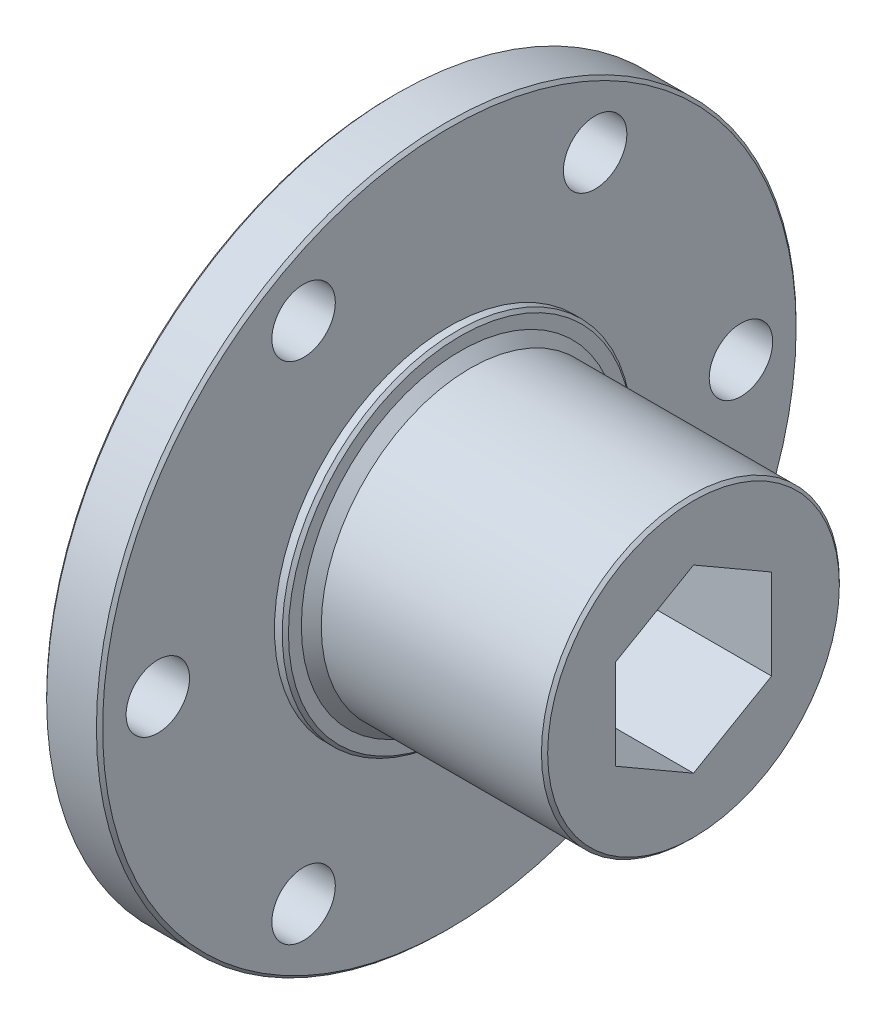
ISO-10303-21;
HEADER;
FILE_DESCRIPTION(('STEP AP214'),'2;1');
FILE_NAME('part.step','',(''),(''),'','','');
FILE_SCHEMA(('AUTOMOTIVE_DESIGN { 1 0 10303 214 1 1 1 1 }'));
ENDSEC;
DATA;
#1=APPLICATION_CONTEXT('core data for automotive mechanical design processes');
#2=APPLICATION_PROTOCOL_DEFINITION('international standard','automotive_design',2000,#1);
#3=PRODUCT_CONTEXT('',#1,'mechanical');
#4=PRODUCT('Part','Part','',(#3));
#5=PRODUCT_RELATED_PRODUCT_CATEGORY('part','',(#4));
#6=PRODUCT_DEFINITION_FORMATION('','',#4);
#7=PRODUCT_DEFINITION_CONTEXT('part definition',#1,'design');
#8=PRODUCT_DEFINITION('design','',#6,#7);
#9=PRODUCT_DEFINITION_SHAPE('','',#8);
#10=(LENGTH_UNIT() NAMED_UNIT(*) SI_UNIT(.MILLI.,.METRE.));
#11=(NAMED_UNIT(*) PLANE_ANGLE_UNIT() SI_UNIT($,.RADIAN.));
#12=(NAMED_UNIT(*) SI_UNIT($,.STERADIAN.) SOLID_ANGLE_UNIT());
#13=UNCERTAINTY_MEASURE_WITH_UNIT(LENGTH_MEASURE(1.E-05),#10,'distance_accuracy_value','');
#14=(GEOMETRIC_REPRESENTATION_CONTEXT(3) GLOBAL_UNCERTAINTY_ASSIGNED_CONTEXT((#13)) GLOBAL_UNIT_ASSIGNED_CONTEXT((#10,
#11,#12)) REPRESENTATION_CONTEXT('',''));
#15=CARTESIAN_POINT('',(0.,0.,0.));
#16=DIRECTION('',(0.,0.,1.));
#17=DIRECTION('',(1.,0.,0.));
#18=AXIS2_PLACEMENT_3D('',#15,#16,#17);
#19=CARTESIAN_POINT('',(-13.9240662460568,0.,0.));
#20=DIRECTION('',(-1.,0.,0.));
#21=DIRECTION('',(0.,0.,1.));
#22=AXIS2_PLACEMENT_3D('',#19,#20,#21);
#23=CYLINDRICAL_SURFACE('',#22,28.575);
#24=CARTESIAN_POINT('',(-18.2420662460566,0.,0.));
#25=DIRECTION('',(-1.,0.,0.));
#26=DIRECTION('',(0.,0.,1.));
#27=AXIS2_PLACEMENT_3D('',#24,#25,#26);
#28=CIRCLE('',#27,28.575);
#29=CARTESIAN_POINT('',(-18.2420662460566,0.,28.575));
#30=VERTEX_POINT('',#29);
#31=EDGE_CURVE('E174',#30,#30,#28,.F.);
#32=ORIENTED_EDGE('',*,*,#31,.T.);
#33=EDGE_LOOP('',(#32));
#34=FACE_BOUND('',#33,.T.);
#35=CARTESIAN_POINT('',(-14.1780662460569,0.,0.));
#36=DIRECTION('',(1.,0.,0.));
#37=DIRECTION('',(0.,0.,-1.));
#38=AXIS2_PLACEMENT_3D('',#35,#36,#37);
#39=CIRCLE('',#38,28.575);
#40=CARTESIAN_POINT('',(-14.1780662460569,0.,-28.575));
#41=VERTEX_POINT('',#40);
#42=EDGE_CURVE('E171',#41,#41,#39,.F.);
#43=ORIENTED_EDGE('',*,*,#42,.T.);
#44=EDGE_LOOP('',(#43));
#45=FACE_BOUND('',#44,.T.);
#46=ADVANCED_FACE('F37',(#34,#45),#23,.T.);
#47=CARTESIAN_POINT('',(-13.9240662460568,28.575,0.));
#48=DIRECTION('',(1.,0.,0.));
#49=DIRECTION('',(0.,0.,-1.));
#50=AXIS2_PLACEMENT_3D('',#47,#48,#49);
#51=PLANE('',#50);
#52=CARTESIAN_POINT('',(-13.9240662460568,0.,0.));
#53=DIRECTION('',(1.,0.,0.));
#54=DIRECTION('',(0.,0.,-1.));
#55=AXIS2_PLACEMENT_3D('',#52,#53,#54);
#56=CIRCLE('',#55,28.3209999999999);
#57=CARTESIAN_POINT('',(-13.9240662460568,0.,-28.3209999999999));
#58=VERTEX_POINT('',#57);
#59=EDGE_CURVE('E11',#58,#58,#56,.T.);
#60=ORIENTED_EDGE('',*,*,#59,.T.);
#61=EDGE_LOOP('',(#60));
#62=FACE_BOUND('',#61,.T.);
#63=CARTESIAN_POINT('',(-13.9240662460568,20.6222299276169,11.90625));
#64=DIRECTION('',(1.,0.,0.));
#65=DIRECTION('',(0.,0.,-1.));
#66=AXIS2_PLACEMENT_3D('',#63,#64,#65);
#67=CIRCLE('',#66,2.5908);
#68=CARTESIAN_POINT('',(-13.9240662460568,20.6222299276169,9.31545000000001));
#69=VERTEX_POINT('',#68);
#70=EDGE_CURVE('E326',#69,#69,#67,.T.);
#71=ORIENTED_EDGE('',*,*,#70,.F.);
#72=EDGE_LOOP('',(#71));
#73=FACE_BOUND('',#72,.T.);
#74=CARTESIAN_POINT('',(-13.9240662460568,0.,-23.8125));
#75=DIRECTION('',(1.,0.,0.));
#76=DIRECTION('',(0.,0.,-1.));
#77=AXIS2_PLACEMENT_3D('',#74,#75,#76);
#78=CIRCLE('',#77,2.5908);
#79=CARTESIAN_POINT('',(-13.9240662460568,0.,-26.4033));
#80=VERTEX_POINT('',#79);
#81=EDGE_CURVE('E331',#80,#80,#78,.T.);
#82=ORIENTED_EDGE('',*,*,#81,.F.);
#83=EDGE_LOOP('',(#82));
#84=FACE_BOUND('',#83,.T.);
#85=CARTESIAN_POINT('',(-13.9240662460568,-20.622229927617,11.9062499999999));
#86=DIRECTION('',(1.,0.,0.));
#87=DIRECTION('',(0.,0.,-1.));
#88=AXIS2_PLACEMENT_3D('',#85,#86,#87);
#89=CIRCLE('',#88,2.5908);
#90=CARTESIAN_POINT('',(-13.9240662460568,-20.622229927617,9.31544999999995));
#91=VERTEX_POINT('',#90);
#92=EDGE_CURVE('E335',#91,#91,#89,.T.);
#93=ORIENTED_EDGE('',*,*,#92,.F.);
#94=EDGE_LOOP('',(#93));
#95=FACE_BOUND('',#94,.T.);
#96=CARTESIAN_POINT('',(-13.9240662460568,-20.6222299276169,-11.90625));
#97=DIRECTION('',(1.,0.,0.));
#98=DIRECTION('',(0.,0.,-1.));
#99=AXIS2_PLACEMENT_3D('',#96,#97,#98);
#100=CIRCLE('',#99,2.5908);
#101=CARTESIAN_POINT('',(-13.9240662460568,-20.6222299276169,-14.49705));
#102=VERTEX_POINT('',#101);
#103=EDGE_CURVE('E339',#102,#102,#100,.T.);
#104=ORIENTED_EDGE('',*,*,#103,.F.);
#105=EDGE_LOOP('',(#104));
#106=FACE_BOUND('',#105,.T.);
#107=CARTESIAN_POINT('',(-13.9240662460568,20.622229927617,-11.90625));
#108=DIRECTION('',(1.,0.,0.));
#109=DIRECTION('',(0.,0.,-1.));
#110=AXIS2_PLACEMENT_3D('',#107,#108,#109);
#111=CIRCLE('',#110,2.5908);
#112=CARTESIAN_POINT('',(-13.9240662460568,20.622229927617,-14.49705));
#113=VERTEX_POINT('',#112);
#114=EDGE_CURVE('E343',#113,#113,#111,.T.);
#115=ORIENTED_EDGE('',*,*,#114,.F.);
#116=EDGE_LOOP('',(#115));
#117=FACE_BOUND('',#116,.T.);
#118=CARTESIAN_POINT('',(-13.9240662460568,0.,23.8125));
#119=DIRECTION('',(1.,0.,0.));
#120=DIRECTION('',(0.,0.,-1.));
#121=AXIS2_PLACEMENT_3D('',#118,#119,#120);
#122=CIRCLE('',#121,2.5908);
#123=CARTESIAN_POINT('',(-13.9240662460568,0.,21.2217));
#124=VERTEX_POINT('',#123);
#125=EDGE_CURVE('E114',#124,#124,#122,.T.);
#126=ORIENTED_EDGE('',*,*,#125,.F.);
#127=EDGE_LOOP('',(#126));
#128=FACE_BOUND('',#127,.T.);
#129=CARTESIAN_POINT('',(-13.9240662460568,0.,0.));
#130=DIRECTION('',(1.,0.,0.));
#131=DIRECTION('',(0.,0.,-1.));
#132=AXIS2_PLACEMENT_3D('',#129,#130,#131);
#133=CIRCLE('',#132,14.2875);
#134=CARTESIAN_POINT('',(-13.9240662460568,0.,-14.2875));
#135=VERTEX_POINT('',#134);
#136=EDGE_CURVE('E153',#135,#135,#133,.T.);
#137=ORIENTED_EDGE('',*,*,#136,.F.);
#138=EDGE_LOOP('',(#137));
#139=FACE_BOUND('',#138,.T.);
#140=ADVANCED_FACE('F209',(#62,#73,#84,#95,#106,#117,#128,#139),#51,.T.);
#141=CARTESIAN_POINT('',(-18.4960662460568,0.,0.));
#142=DIRECTION('',(-1.,0.,0.));
#143=DIRECTION('',(0.,0.,1.));
#144=AXIS2_PLACEMENT_3D('',#141,#142,#143);
#145=PLANE('',#144);
#146=CARTESIAN_POINT('',(-18.4960662460568,0.,0.));
#147=DIRECTION('',(-1.,0.,0.));
#148=DIRECTION('',(0.,0.,1.));
#149=AXIS2_PLACEMENT_3D('',#146,#147,#148);
#150=CIRCLE('',#149,28.3209999999999);
#151=CARTESIAN_POINT('',(-18.4960662460568,0.,28.3209999999999));
#152=VERTEX_POINT('',#151);
#153=EDGE_CURVE('E168',#152,#152,#150,.T.);
#154=ORIENTED_EDGE('',*,*,#153,.T.);
#155=EDGE_LOOP('',(#154));
#156=FACE_BOUND('',#155,.T.);
#157=CARTESIAN_POINT('',(-18.4960662460568,20.6222299276169,11.90625));
#158=DIRECTION('',(-1.,0.,0.));
#159=DIRECTION('',(0.,0.,1.));
#160=AXIS2_PLACEMENT_3D('',#157,#158,#159);
#161=CIRCLE('',#160,2.5908);
#162=CARTESIAN_POINT('',(-18.4960662460568,20.6222299276169,14.49705));
#163=VERTEX_POINT('',#162);
#164=EDGE_CURVE('E243',#163,#163,#161,.T.);
#165=ORIENTED_EDGE('',*,*,#164,.F.);
#166=EDGE_LOOP('',(#165));
#167=FACE_BOUND('',#166,.T.);
#168=CARTESIAN_POINT('',(-18.4960662460568,0.,-23.8125));
#169=DIRECTION('',(-1.,0.,0.));
#170=DIRECTION('',(0.,0.,1.));
#171=AXIS2_PLACEMENT_3D('',#168,#169,#170);
#172=CIRCLE('',#171,2.5908);
#173=CARTESIAN_POINT('',(-18.4960662460568,0.,-21.2217));
#174=VERTEX_POINT('',#173);
#175=EDGE_CURVE('E247',#174,#174,#172,.T.);
#176=ORIENTED_EDGE('',*,*,#175,.F.);
#177=EDGE_LOOP('',(#176));
#178=FACE_BOUND('',#177,.T.);
#179=CARTESIAN_POINT('',(-18.4960662460568,-20.622229927617,11.9062499999999));
#180=DIRECTION('',(-1.,0.,0.));
#181=DIRECTION('',(0.,0.,1.));
#182=AXIS2_PLACEMENT_3D('',#179,#180,#181);
#183=CIRCLE('',#182,2.5908);
#184=CARTESIAN_POINT('',(-18.4960662460568,-20.622229927617,14.4970499999999));
#185=VERTEX_POINT('',#184);
#186=EDGE_CURVE('E251',#185,#185,#183,.T.);
#187=ORIENTED_EDGE('',*,*,#186,.F.);
#188=EDGE_LOOP('',(#187));
#189=FACE_BOUND('',#188,.T.);
#190=CARTESIAN_POINT('',(-18.4960662460568,-20.6222299276169,-11.90625));
#191=DIRECTION('',(-1.,0.,0.));
#192=DIRECTION('',(0.,0.,1.));
#193=AXIS2_PLACEMENT_3D('',#190,#191,#192);
#194=CIRCLE('',#193,2.5908);
#195=CARTESIAN_POINT('',(-18.4960662460568,-20.6222299276169,-9.31545000000004));
#196=VERTEX_POINT('',#195);
#197=EDGE_CURVE('E255',#196,#196,#194,.T.);
#198=ORIENTED_EDGE('',*,*,#197,.F.);
#199=EDGE_LOOP('',(#198));
#200=FACE_BOUND('',#199,.T.);
#201=CARTESIAN_POINT('',(-18.4960662460568,20.622229927617,-11.90625));
#202=DIRECTION('',(-1.,0.,0.));
#203=DIRECTION('',(0.,0.,1.));
#204=AXIS2_PLACEMENT_3D('',#201,#202,#203);
#205=CIRCLE('',#204,2.5908);
#206=CARTESIAN_POINT('',(-18.4960662460568,20.622229927617,-9.31544999999997));
#207=VERTEX_POINT('',#206);
#208=EDGE_CURVE('E259',#207,#207,#205,.T.);
#209=ORIENTED_EDGE('',*,*,#208,.F.);
#210=EDGE_LOOP('',(#209));
#211=FACE_BOUND('',#210,.T.);
#212=CARTESIAN_POINT('',(-18.4960662460568,0.,23.8125));
#213=DIRECTION('',(-1.,0.,0.));
#214=DIRECTION('',(0.,0.,1.));
#215=AXIS2_PLACEMENT_3D('',#212,#213,#214);
#216=CIRCLE('',#215,2.5908);
#217=CARTESIAN_POINT('',(-18.4960662460568,0.,26.4033));
#218=VERTEX_POINT('',#217);
#219=EDGE_CURVE('E263',#218,#218,#216,.T.);
#220=ORIENTED_EDGE('',*,*,#219,.F.);
#221=EDGE_LOOP('',(#220));
#222=FACE_BOUND('',#221,.T.);
#223=CARTESIAN_POINT('',(-18.4960662460568,0.,0.));
#224=DIRECTION('',(-1.,0.,0.));
#225=DIRECTION('',(0.,0.,1.));
#226=AXIS2_PLACEMENT_3D('',#223,#224,#225);
#227=CIRCLE('',#226,14.2875);
#228=CARTESIAN_POINT('',(-18.4960662460568,0.,14.2875));
#229=VERTEX_POINT('',#228);
#230=EDGE_CURVE('E137',#229,#229,#227,.T.);
#231=ORIENTED_EDGE('',*,*,#230,.F.);
#232=EDGE_LOOP('',(#231));
#233=FACE_BOUND('',#232,.T.);
#234=ADVANCED_FACE('F215',(#156,#167,#178,#189,#200,#211,#222,#233),#145,.T.);
#235=CARTESIAN_POINT('',(-13.0350662460568,0.,0.));
#236=DIRECTION('',(-1.,0.,0.));
#237=DIRECTION('',(0.,0.,1.));
#238=AXIS2_PLACEMENT_3D('',#235,#236,#237);
#239=CYLINDRICAL_SURFACE('',#238,14.2875);
#240=CARTESIAN_POINT('',(-13.2890662460569,0.,0.));
#241=DIRECTION('',(1.,0.,0.));
#242=DIRECTION('',(0.,0.,-1.));
#243=AXIS2_PLACEMENT_3D('',#240,#241,#242);
#244=CIRCLE('',#243,14.2875);
#245=CARTESIAN_POINT('',(-13.2890662460569,0.,-14.2875));
#246=VERTEX_POINT('',#245);
#247=EDGE_CURVE('E45',#246,#246,#244,.F.);
#248=ORIENTED_EDGE('',*,*,#247,.T.);
#249=EDGE_LOOP('',(#248));
#250=FACE_BOUND('',#249,.T.);
#251=ORIENTED_EDGE('',*,*,#136,.T.);
#252=EDGE_LOOP('',(#251));
#253=FACE_BOUND('',#252,.T.);
#254=ADVANCED_FACE('F182',(#250,#253),#239,.T.);
#255=CARTESIAN_POINT('',(-13.0350662460568,0.,0.));
#256=DIRECTION('',(1.,0.,0.));
#257=DIRECTION('',(0.,0.,-1.));
#258=AXIS2_PLACEMENT_3D('',#255,#256,#257);
#259=PLANE('',#258);
#260=CARTESIAN_POINT('',(-13.0350662460568,0.,0.));
#261=DIRECTION('',(1.,0.,0.));
#262=DIRECTION('',(0.,0.,-1.));
#263=AXIS2_PLACEMENT_3D('',#260,#261,#262);
#264=CIRCLE('',#263,14.0334999999999);
#265=CARTESIAN_POINT('',(-13.0350662460568,0.,-14.0334999999999));
#266=VERTEX_POINT('',#265);
#267=EDGE_CURVE('E177',#266,#266,#264,.T.);
#268=ORIENTED_EDGE('',*,*,#267,.T.);
#269=EDGE_LOOP('',(#268));
#270=FACE_BOUND('',#269,.T.);
#271=CARTESIAN_POINT('',(-13.0350662460568,0.,0.));
#272=DIRECTION('',(1.,0.,0.));
#273=DIRECTION('',(0.,0.,-1.));
#274=AXIS2_PLACEMENT_3D('',#271,#272,#273);
#275=CIRCLE('',#274,12.9794);
#276=CARTESIAN_POINT('',(-13.0350662460568,0.,-12.9794));
#277=VERTEX_POINT('',#276);
#278=EDGE_CURVE('E147',#277,#277,#275,.T.);
#279=ORIENTED_EDGE('',*,*,#278,.F.);
#280=EDGE_LOOP('',(#279));
#281=FACE_BOUND('',#280,.T.);
#282=ADVANCED_FACE('F191',(#270,#281),#259,.T.);
#283=CARTESIAN_POINT('',(-13.0350662460568,0.,0.));
#284=DIRECTION('',(-1.,0.,0.));
#285=DIRECTION('',(0.,0.,-1.));
#286=AXIS2_PLACEMENT_3D('',#283,#284,#285);
#287=CONICAL_SURFACE('',#286,12.9794,0.785398163397434);
#288=CARTESIAN_POINT('',(-12.2222662460567,0.,0.));
#289=DIRECTION('',(1.,0.,0.));
#290=DIRECTION('',(0.,0.,-1.));
#291=AXIS2_PLACEMENT_3D('',#288,#289,#290);
#292=CIRCLE('',#291,12.1666);
#293=CARTESIAN_POINT('',(-12.2222662460567,0.,12.1666));
#294=VERTEX_POINT('',#293);
#295=EDGE_CURVE('E150',#294,#294,#292,.T.);
#296=ORIENTED_EDGE('',*,*,#295,.F.);
#297=EDGE_LOOP('',(#296));
#298=FACE_BOUND('',#297,.T.);
#299=ORIENTED_EDGE('',*,*,#278,.T.);
#300=EDGE_LOOP('',(#299));
#301=FACE_BOUND('',#300,.T.);
#302=ADVANCED_FACE('F194',(#298,#301),#287,.T.);
#303=CARTESIAN_POINT('',(6.01493375394323,0.,0.));
#304=DIRECTION('',(-1.,0.,0.));
#305=DIRECTION('',(0.,0.,1.));
#306=AXIS2_PLACEMENT_3D('',#303,#304,#305);
#307=CYLINDRICAL_SURFACE('',#306,12.1666);
#308=CARTESIAN_POINT('',(5.76093375394317,0.,0.));
#309=DIRECTION('',(1.,0.,0.));
#310=DIRECTION('',(0.,0.,-1.));
#311=AXIS2_PLACEMENT_3D('',#308,#309,#310);
#312=CIRCLE('',#311,12.1666);
#313=CARTESIAN_POINT('',(5.76093375394317,0.,12.1666));
#314=VERTEX_POINT('',#313);
#315=EDGE_CURVE('E165',#314,#314,#312,.F.);
#316=CARTESIAN_POINT('',(5.76093375394317,0.,12.1666));
#317=CARTESIAN_POINT('',(5.57360875394317,0.,12.1666));
#318=CARTESIAN_POINT('',(5.38628375394317,0.,12.1666));
#319=CARTESIAN_POINT('',(5.01163375394318,0.,12.1666));
#320=CARTESIAN_POINT('',(4.82430875394318,0.,12.1666));
#321=CARTESIAN_POINT('',(4.44965875394318,0.,12.1666));
#322=CARTESIAN_POINT('',(4.26233375394318,0.,12.1666));
#323=CARTESIAN_POINT('',(3.88768375394318,0.,12.1666));
#324=CARTESIAN_POINT('',(3.70035875394318,0.,12.1666));
#325=CARTESIAN_POINT('',(3.32570875394319,0.,12.1666));
#326=CARTESIAN_POINT('',(3.13838375394319,0.,12.1666));
#327=CARTESIAN_POINT('',(2.76373375394319,0.,12.1666));
#328=CARTESIAN_POINT('',(2.57640875394319,0.,12.1666));
#329=CARTESIAN_POINT('',(2.20175875394319,0.,12.1666));
#330=CARTESIAN_POINT('',(2.01443375394319,0.,12.1666));
#331=CARTESIAN_POINT('',(1.6397837539432,0.,12.1666));
#332=CARTESIAN_POINT('',(1.4524587539432,0.,12.1666));
#333=CARTESIAN_POINT('',(1.0778087539432,0.,12.1666));
#334=CARTESIAN_POINT('',(0.890483753943201,0.,12.1666));
#335=CARTESIAN_POINT('',(0.515833753943203,0.,12.1666));
#336=CARTESIAN_POINT('',(0.328508753943204,0.,12.1666));
#337=CARTESIAN_POINT('',(-0.0461412460567937,0.,12.1666));
#338=CARTESIAN_POINT('',(-0.233466246056793,0.,12.1666));
#339=CARTESIAN_POINT('',(-0.60811624605679,0.,12.1666));
#340=CARTESIAN_POINT('',(-0.795441246056789,0.,12.1666));
#341=CARTESIAN_POINT('',(-1.17009124605679,0.,12.1666));
#342=CARTESIAN_POINT('',(-1.35741624605678,0.,12.1666));
#343=CARTESIAN_POINT('',(-1.73206624605678,0.,12.1666));
#344=CARTESIAN_POINT('',(-1.91939124605678,0.,12.1666));
#345=CARTESIAN_POINT('',(-2.29404124605678,0.,12.1666));
#346=CARTESIAN_POINT('',(-2.48136624605678,0.,12.1666));
#347=CARTESIAN_POINT('',(-2.85601624605678,0.,12.1666));
#348=CARTESIAN_POINT('',(-3.04334124605677,0.,12.1666));
#349=CARTESIAN_POINT('',(-3.41799124605677,0.,12.1666));
#350=CARTESIAN_POINT('',(-3.60531624605677,0.,12.1666));
#351=CARTESIAN_POINT('',(-3.97996624605677,0.,12.1666));
#352=CARTESIAN_POINT('',(-4.16729124605677,0.,12.1666));
#353=CARTESIAN_POINT('',(-4.54194124605676,0.,12.1666));
#354=CARTESIAN_POINT('',(-4.72926624605676,0.,12.1666));
#355=CARTESIAN_POINT('',(-5.10391624605676,0.,12.1666));
#356=CARTESIAN_POINT('',(-5.29124124605676,0.,12.1666));
#357=CARTESIAN_POINT('',(-5.66589124605676,0.,12.1666));
#358=CARTESIAN_POINT('',(-5.85321624605676,0.,12.1666));
#359=CARTESIAN_POINT('',(-6.22786624605675,0.,12.1666));
#360=CARTESIAN_POINT('',(-6.41519124605675,0.,12.1666));
#361=CARTESIAN_POINT('',(-6.78984124605675,0.,12.1666));
#362=CARTESIAN_POINT('',(-6.97716624605675,0.,12.1666));
#363=CARTESIAN_POINT('',(-7.35181624605675,0.,12.1666));
#364=CARTESIAN_POINT('',(-7.53914124605675,0.,12.1666));
#365=CARTESIAN_POINT('',(-7.91379124605674,0.,12.1666));
#366=CARTESIAN_POINT('',(-8.10111624605674,0.,12.1666));
#367=CARTESIAN_POINT('',(-8.47576624605674,0.,12.1666));
#368=CARTESIAN_POINT('',(-8.66309124605674,0.,12.1666));
#369=CARTESIAN_POINT('',(-9.03774124605674,0.,12.1666));
#370=CARTESIAN_POINT('',(-9.22506624605674,0.,12.1666));
#371=CARTESIAN_POINT('',(-9.59971624605673,0.,12.1666));
#372=CARTESIAN_POINT('',(-9.78704124605673,0.,12.1666));
#373=CARTESIAN_POINT('',(-10.1616912460567,0.,12.1666));
#374=CARTESIAN_POINT('',(-10.3490162460567,0.,12.1666));
#375=CARTESIAN_POINT('',(-10.7236662460567,0.,12.1666));
#376=CARTESIAN_POINT('',(-10.9109912460567,0.,12.1666));
#377=CARTESIAN_POINT('',(-11.2856412460567,0.,12.1666));
#378=CARTESIAN_POINT('',(-11.4729662460567,0.,12.1666));
#379=CARTESIAN_POINT('',(-11.8476162460567,0.,12.1666));
#380=CARTESIAN_POINT('',(-12.0349412460567,0.,12.1666));
#381=CARTESIAN_POINT('',(-12.2222662460567,0.,12.1666));
#382=B_SPLINE_CURVE_WITH_KNOTS('',3,(#316,#317,#318,#319,#320,#321,#322,#323,#324,#325,#326,
#327,#328,#329,#330,#331,#332,#333,#334,#335,#336,#337,#338,#339,#340,#341,#342,#343,#344,#345,
#346,#347,#348,#349,#350,#351,#352,#353,#354,#355,#356,#357,#358,#359,#360,#361,#362,#363,#364,
#365,#366,#367,#368,#369,#370,#371,#372,#373,#374,#375,#376,#377,#378,#379,#380,#381),
.UNSPECIFIED.,.F.,.F.,(4,2,2,2,2,2,2,2,2,2,2,2,2,2,2,2,2,2,2,2,2,2,2,2,2,2,2,2,2,2,2,2,4),(0.,
0.561974999999996,1.12394999999999,1.68592499999999,2.24789999999999,2.80987499999998,
3.37184999999998,3.93382499999997,4.49579999999997,5.05777499999997,5.61974999999997,
6.18172499999996,6.74369999999996,7.30567499999995,7.86764999999995,8.42962499999995,
8.99159999999994,9.55357499999994,10.1155499999999,10.6775249999999,11.2394999999999,
11.8014749999999,12.3634499999999,12.9254249999999,13.4873999999999,14.0493749999999,
14.6113499999999,15.1733249999999,15.7352999999999,16.2972749999999,16.8592499999999,
17.4212249999999,17.9831999999999),.UNSPECIFIED.);
#383=EDGE_CURVE('BSEAM199',#314,#294,#382,.T.);
#384=ORIENTED_EDGE('',*,*,#315,.T.);
#385=ORIENTED_EDGE('',*,*,#295,.T.);
#386=ORIENTED_EDGE('',*,*,#383,.T.);
#387=ORIENTED_EDGE('',*,*,#383,.F.);
#388=EDGE_LOOP('',(#384,#386,#385,#387));
#389=FACE_BOUND('',#388,.T.);
#390=ADVANCED_FACE('F199',(#389),#307,.T.);
#391=CARTESIAN_POINT('',(6.01493375394323,0.,0.));
#392=DIRECTION('',(1.,0.,0.));
#393=DIRECTION('',(0.,0.,-1.));
#394=AXIS2_PLACEMENT_3D('',#391,#392,#393);
#395=PLANE('',#394);
#396=CARTESIAN_POINT('',(6.01493375394323,0.,0.));
#397=DIRECTION('',(1.,0.,0.));
#398=DIRECTION('',(0.,0.,-1.));
#399=AXIS2_PLACEMENT_3D('',#396,#397,#398);
#400=CIRCLE('',#399,11.9125999999999);
#401=CARTESIAN_POINT('',(6.01493375394323,0.,-11.9125999999999));
#402=VERTEX_POINT('',#401);
#403=EDGE_CURVE('E162',#402,#402,#400,.T.);
#404=ORIENTED_EDGE('',*,*,#403,.T.);
#405=EDGE_LOOP('',(#404));
#406=FACE_BOUND('',#405,.T.);
#407=DIRECTION('',(0.,0.500000000000001,-0.866025403784438));
#408=VECTOR('',#407,1.);
#409=CARTESIAN_POINT('',(6.01493375394323,3.68081890619155,6.3754));
#410=LINE('',#409,#408);
#411=CARTESIAN_POINT('',(6.01493375394323,3.68081890619155,6.3754));
#412=VERTEX_POINT('',#411);
#413=CARTESIAN_POINT('',(6.01493375394323,7.3616578123831,0.));
#414=VERTEX_POINT('',#413);
#415=EDGE_CURVE('E92',#412,#414,#410,.T.);
#416=ORIENTED_EDGE('',*,*,#415,.T.);
#417=DIRECTION('',(0.,-0.500000000000001,-0.866025403784438));
#418=VECTOR('',#417,1.);
#419=CARTESIAN_POINT('',(6.01493375394323,7.3616578123831,0.));
#420=LINE('',#419,#418);
#421=CARTESIAN_POINT('',(6.01493375394323,3.68081890619154,-6.37539999999999));
#422=VERTEX_POINT('',#421);
#423=EDGE_CURVE('E101',#414,#422,#420,.T.);
#424=ORIENTED_EDGE('',*,*,#423,.T.);
#425=DIRECTION('',(0.,-1.,0.));
#426=VECTOR('',#425,1.);
#427=CARTESIAN_POINT('',(6.01493375394323,3.68081890619155,-6.37539999999999));
#428=LINE('',#427,#426);
#429=CARTESIAN_POINT('',(6.01493375394323,-3.68085890619153,-6.37539999999999));
#430=VERTEX_POINT('',#429);
#431=EDGE_CURVE('E52',#422,#430,#428,.T.);
#432=ORIENTED_EDGE('',*,*,#431,.T.);
#433=DIRECTION('',(0.,-0.500000000000001,0.866025403784438));
#434=VECTOR('',#433,1.);
#435=CARTESIAN_POINT('',(6.01493375394323,-3.68085890619153,-6.37539999999999));
#436=LINE('',#435,#434);
#437=CARTESIAN_POINT('',(6.01493375394323,-7.36169781238308,0.));
#438=VERTEX_POINT('',#437);
#439=EDGE_CURVE('E118',#430,#438,#436,.T.);
#440=ORIENTED_EDGE('',*,*,#439,.T.);
#441=DIRECTION('',(0.,0.500000000000001,0.866025403784438));
#442=VECTOR('',#441,1.);
#443=CARTESIAN_POINT('',(6.01493375394323,-7.36169781238308,0.));
#444=LINE('',#443,#442);
#445=CARTESIAN_POINT('',(6.01493375394323,-3.68085890619153,6.3754));
#446=VERTEX_POINT('',#445);
#447=EDGE_CURVE('E121',#438,#446,#444,.T.);
#448=ORIENTED_EDGE('',*,*,#447,.T.);
#449=DIRECTION('',(0.,1.,0.));
#450=VECTOR('',#449,1.);
#451=CARTESIAN_POINT('',(6.01493375394323,-3.68085890619153,6.3754));
#452=LINE('',#451,#450);
#453=EDGE_CURVE('E98',#446,#412,#452,.T.);
#454=ORIENTED_EDGE('',*,*,#453,.T.);
#455=EDGE_LOOP('',(#416,#424,#432,#440,#448,#454));
#456=FACE_BOUND('',#455,.T.);
#457=ADVANCED_FACE('F105',(#406,#456),#395,.T.);
#458=CARTESIAN_POINT('',(-19.3850662460568,0.,0.));
#459=DIRECTION('',(1.,0.,0.));
#460=DIRECTION('',(0.,0.,-1.));
#461=AXIS2_PLACEMENT_3D('',#458,#459,#460);
#462=CYLINDRICAL_SURFACE('',#461,14.2875);
#463=CARTESIAN_POINT('',(-19.1310662460567,0.,0.));
#464=DIRECTION('',(-1.,0.,0.));
#465=DIRECTION('',(0.,0.,1.));
#466=AXIS2_PLACEMENT_3D('',#463,#464,#465);
#467=CIRCLE('',#466,14.2875);
#468=CARTESIAN_POINT('',(-19.1310662460567,0.,14.2875));
#469=VERTEX_POINT('',#468);
#470=EDGE_CURVE('E159',#469,#469,#467,.F.);
#471=ORIENTED_EDGE('',*,*,#470,.T.);
#472=EDGE_LOOP('',(#471));
#473=FACE_BOUND('',#472,.T.);
#474=ORIENTED_EDGE('',*,*,#230,.T.);
#475=EDGE_LOOP('',(#474));
#476=FACE_BOUND('',#475,.T.);
#477=ADVANCED_FACE('F266',(#473,#476),#462,.T.);
#478=CARTESIAN_POINT('',(-19.3850662460568,0.,0.));
#479=DIRECTION('',(-1.,0.,0.));
#480=DIRECTION('',(0.,0.,1.));
#481=AXIS2_PLACEMENT_3D('',#478,#479,#480);
#482=PLANE('',#481);
#483=CARTESIAN_POINT('',(-19.3850662460568,0.,0.));
#484=DIRECTION('',(-1.,0.,0.));
#485=DIRECTION('',(0.,0.,1.));
#486=AXIS2_PLACEMENT_3D('',#483,#484,#485);
#487=CIRCLE('',#486,14.0334999999999);
#488=CARTESIAN_POINT('',(-19.3850662460568,0.,14.0334999999999));
#489=VERTEX_POINT('',#488);
#490=EDGE_CURVE('E156',#489,#489,#487,.T.);
#491=ORIENTED_EDGE('',*,*,#490,.T.);
#492=EDGE_LOOP('',(#491));
#493=FACE_BOUND('',#492,.T.);
#494=DIRECTION('',(0.,0.500000000000001,-0.866025403784438));
#495=VECTOR('',#494,1.);
#496=CARTESIAN_POINT('',(-19.3850662460568,3.68081890619155,6.3754));
#497=LINE('',#496,#495);
#498=CARTESIAN_POINT('',(-19.3850662460568,3.68081890619155,6.3754));
#499=VERTEX_POINT('',#498);
#500=CARTESIAN_POINT('',(-19.3850662460568,7.36165781238309,0.));
#501=VERTEX_POINT('',#500);
#502=EDGE_CURVE('E60',#499,#501,#497,.T.);
#503=ORIENTED_EDGE('',*,*,#502,.F.);
#504=DIRECTION('',(0.,1.,0.));
#505=VECTOR('',#504,1.);
#506=CARTESIAN_POINT('',(-19.3850662460568,-3.68085890619153,6.3754));
#507=LINE('',#506,#505);
#508=CARTESIAN_POINT('',(-19.3850662460568,-3.68085890619153,6.3754));
#509=VERTEX_POINT('',#508);
#510=EDGE_CURVE('E108',#509,#499,#507,.T.);
#511=ORIENTED_EDGE('',*,*,#510,.F.);
#512=DIRECTION('',(0.,0.500000000000001,0.866025403784438));
#513=VECTOR('',#512,1.);
#514=CARTESIAN_POINT('',(-19.3850662460568,-7.36169781238308,0.));
#515=LINE('',#514,#513);
#516=CARTESIAN_POINT('',(-19.3850662460568,-7.36169781238308,0.));
#517=VERTEX_POINT('',#516);
#518=EDGE_CURVE('E111',#517,#509,#515,.T.);
#519=ORIENTED_EDGE('',*,*,#518,.F.);
#520=DIRECTION('',(0.,-0.500000000000001,0.866025403784438));
#521=VECTOR('',#520,1.);
#522=CARTESIAN_POINT('',(-19.3850662460568,-3.68085890619153,-6.37539999999999));
#523=LINE('',#522,#521);
#524=CARTESIAN_POINT('',(-19.3850662460568,-3.68085890619153,-6.37539999999999));
#525=VERTEX_POINT('',#524);
#526=EDGE_CURVE('E130',#525,#517,#523,.T.);
#527=ORIENTED_EDGE('',*,*,#526,.F.);
#528=DIRECTION('',(0.,-1.,0.));
#529=VECTOR('',#528,1.);
#530=CARTESIAN_POINT('',(-19.3850662460568,3.68081890619155,-6.37539999999999));
#531=LINE('',#530,#529);
#532=CARTESIAN_POINT('',(-19.3850662460568,3.68081890619155,-6.37539999999999));
#533=VERTEX_POINT('',#532);
#534=EDGE_CURVE('E127',#533,#525,#531,.T.);
#535=ORIENTED_EDGE('',*,*,#534,.F.);
#536=DIRECTION('',(0.,-0.500000000000001,-0.866025403784438));
#537=VECTOR('',#536,1.);
#538=CARTESIAN_POINT('',(-19.3850662460568,7.3616578123831,0.));
#539=LINE('',#538,#537);
#540=EDGE_CURVE('E125',#501,#533,#539,.T.);
#541=ORIENTED_EDGE('',*,*,#540,.F.);
#542=EDGE_LOOP('',(#503,#511,#519,#527,#535,#541));
#543=FACE_BOUND('',#542,.T.);
#544=ADVANCED_FACE('F268',(#493,#543),#482,.T.);
#545=CARTESIAN_POINT('',(6.01493375394323,3.68081890619155,6.3754));
#546=DIRECTION('',(0.,0.866025403784438,0.500000000000001));
#547=DIRECTION('',(0.,-0.500000000000001,0.866025403784438));
#548=AXIS2_PLACEMENT_3D('',#545,#546,#547);
#549=PLANE('',#548);
#550=ORIENTED_EDGE('',*,*,#502,.T.);
#551=DIRECTION('',(-1.,0.,0.));
#552=VECTOR('',#551,1.);
#553=CARTESIAN_POINT('',(6.01493375394323,7.3616578123831,0.));
#554=LINE('',#553,#552);
#555=EDGE_CURVE('E88',#414,#501,#554,.T.);
#556=ORIENTED_EDGE('',*,*,#555,.F.);
#557=ORIENTED_EDGE('',*,*,#415,.F.);
#558=DIRECTION('',(-1.,0.,0.));
#559=VECTOR('',#558,1.);
#560=CARTESIAN_POINT('',(6.01493375394323,3.68081890619155,6.3754));
#561=LINE('',#560,#559);
#562=EDGE_CURVE('E135',#412,#499,#561,.T.);
#563=ORIENTED_EDGE('',*,*,#562,.T.);
#564=EDGE_LOOP('',(#550,#556,#557,#563));
#565=FACE_BOUND('',#564,.T.);
#566=ADVANCED_FACE('F90',(#565),#549,.F.);
#567=CARTESIAN_POINT('',(6.01493375394323,-3.68085890619153,6.3754));
#568=DIRECTION('',(0.,0.,1.));
#569=DIRECTION('',(0.,-1.,0.));
#570=AXIS2_PLACEMENT_3D('',#567,#568,#569);
#571=PLANE('',#570);
#572=ORIENTED_EDGE('',*,*,#510,.T.);
#573=ORIENTED_EDGE('',*,*,#562,.F.);
#574=ORIENTED_EDGE('',*,*,#453,.F.);
#575=DIRECTION('',(-1.,0.,0.));
#576=VECTOR('',#575,1.);
#577=CARTESIAN_POINT('',(6.01493375394323,-3.68085890619153,6.3754));
#578=LINE('',#577,#576);
#579=EDGE_CURVE('E138',#446,#509,#578,.T.);
#580=ORIENTED_EDGE('',*,*,#579,.T.);
#581=EDGE_LOOP('',(#572,#573,#574,#580));
#582=FACE_BOUND('',#581,.T.);
#583=ADVANCED_FACE('F282',(#582),#571,.F.);
#584=CARTESIAN_POINT('',(6.01493375394323,-7.36169781238308,0.));
#585=DIRECTION('',(0.,-0.866025403784438,0.500000000000001));
#586=DIRECTION('',(0.,-0.500000000000001,-0.866025403784438));
#587=AXIS2_PLACEMENT_3D('',#584,#585,#586);
#588=PLANE('',#587);
#589=ORIENTED_EDGE('',*,*,#518,.T.);
#590=ORIENTED_EDGE('',*,*,#579,.F.);
#591=ORIENTED_EDGE('',*,*,#447,.F.);
#592=DIRECTION('',(-1.,0.,0.));
#593=VECTOR('',#592,1.);
#594=CARTESIAN_POINT('',(6.01493375394323,-7.36169781238308,0.));
#595=LINE('',#594,#593);
#596=EDGE_CURVE('E140',#438,#517,#595,.T.);
#597=ORIENTED_EDGE('',*,*,#596,.T.);
#598=EDGE_LOOP('',(#589,#590,#591,#597));
#599=FACE_BOUND('',#598,.T.);
#600=ADVANCED_FACE('F292',(#599),#588,.F.);
#601=CARTESIAN_POINT('',(6.01493375394323,-3.68085890619153,-6.37539999999999));
#602=DIRECTION('',(0.,-0.866025403784438,-0.500000000000001));
#603=DIRECTION('',(0.,0.500000000000001,-0.866025403784438));
#604=AXIS2_PLACEMENT_3D('',#601,#602,#603);
#605=PLANE('',#604);
#606=ORIENTED_EDGE('',*,*,#526,.T.);
#607=ORIENTED_EDGE('',*,*,#596,.F.);
#608=ORIENTED_EDGE('',*,*,#439,.F.);
#609=DIRECTION('',(-1.,0.,0.));
#610=VECTOR('',#609,1.);
#611=CARTESIAN_POINT('',(6.01493375394323,-3.68085890619153,-6.37539999999999));
#612=LINE('',#611,#610);
#613=EDGE_CURVE('E142',#430,#525,#612,.T.);
#614=ORIENTED_EDGE('',*,*,#613,.T.);
#615=EDGE_LOOP('',(#606,#607,#608,#614));
#616=FACE_BOUND('',#615,.T.);
#617=ADVANCED_FACE('F289',(#616),#605,.F.);
#618=CARTESIAN_POINT('',(6.01493375394323,3.68081890619155,-6.37539999999999));
#619=DIRECTION('',(0.,0.,-1.));
#620=DIRECTION('',(0.,1.,0.));
#621=AXIS2_PLACEMENT_3D('',#618,#619,#620);
#622=PLANE('',#621);
#623=ORIENTED_EDGE('',*,*,#534,.T.);
#624=ORIENTED_EDGE('',*,*,#613,.F.);
#625=ORIENTED_EDGE('',*,*,#431,.F.);
#626=DIRECTION('',(-1.,0.,0.));
#627=VECTOR('',#626,1.);
#628=CARTESIAN_POINT('',(6.01493375394323,3.68081890619155,-6.37539999999999));
#629=LINE('',#628,#627);
#630=EDGE_CURVE('E97',#422,#533,#629,.T.);
#631=ORIENTED_EDGE('',*,*,#630,.T.);
#632=EDGE_LOOP('',(#623,#624,#625,#631));
#633=FACE_BOUND('',#632,.T.);
#634=ADVANCED_FACE('F286',(#633),#622,.F.);
#635=CARTESIAN_POINT('',(6.01493375394323,7.3616578123831,0.));
#636=DIRECTION('',(0.,0.866025403784438,-0.500000000000001));
#637=DIRECTION('',(0.,0.500000000000001,0.866025403784438));
#638=AXIS2_PLACEMENT_3D('',#635,#636,#637);
#639=PLANE('',#638);
#640=ORIENTED_EDGE('',*,*,#540,.T.);
#641=ORIENTED_EDGE('',*,*,#630,.F.);
#642=ORIENTED_EDGE('',*,*,#423,.F.);
#643=ORIENTED_EDGE('',*,*,#555,.T.);
#644=EDGE_LOOP('',(#640,#641,#642,#643));
#645=FACE_BOUND('',#644,.T.);
#646=ADVANCED_FACE('F102',(#645),#639,.F.);
#647=CARTESIAN_POINT('',(-18.4960662460568,0.,23.8125));
#648=DIRECTION('',(-1.,0.,0.));
#649=DIRECTION('',(0.,0.,1.));
#650=AXIS2_PLACEMENT_3D('',#647,#648,#649);
#651=CYLINDRICAL_SURFACE('',#650,2.5908);
#652=ORIENTED_EDGE('',*,*,#125,.T.);
#653=EDGE_LOOP('',(#652));
#654=FACE_BOUND('',#653,.T.);
#655=ORIENTED_EDGE('',*,*,#219,.T.);
#656=EDGE_LOOP('',(#655));
#657=FACE_BOUND('',#656,.T.);
#658=ADVANCED_FACE('F285',(#654,#657),#651,.F.);
#659=CARTESIAN_POINT('',(-18.4960662460568,20.622229927617,-11.90625));
#660=DIRECTION('',(-1.,0.,0.));
#661=DIRECTION('',(0.,0.,1.));
#662=AXIS2_PLACEMENT_3D('',#659,#660,#661);
#663=CYLINDRICAL_SURFACE('',#662,2.5908);
#664=ORIENTED_EDGE('',*,*,#114,.T.);
#665=EDGE_LOOP('',(#664));
#666=FACE_BOUND('',#665,.T.);
#667=ORIENTED_EDGE('',*,*,#208,.T.);
#668=EDGE_LOOP('',(#667));
#669=FACE_BOUND('',#668,.T.);
#670=ADVANCED_FACE('F302',(#666,#669),#663,.F.);
#671=CARTESIAN_POINT('',(-18.4960662460568,-20.6222299276169,-11.90625));
#672=DIRECTION('',(-1.,0.,0.));
#673=DIRECTION('',(0.,0.,1.));
#674=AXIS2_PLACEMENT_3D('',#671,#672,#673);
#675=CYLINDRICAL_SURFACE('',#674,2.5908);
#676=ORIENTED_EDGE('',*,*,#103,.T.);
#677=EDGE_LOOP('',(#676));
#678=FACE_BOUND('',#677,.T.);
#679=ORIENTED_EDGE('',*,*,#197,.T.);
#680=EDGE_LOOP('',(#679));
#681=FACE_BOUND('',#680,.T.);
#682=ADVANCED_FACE('F306',(#678,#681),#675,.F.);
#683=CARTESIAN_POINT('',(-18.4960662460568,-20.622229927617,11.9062499999999));
#684=DIRECTION('',(-1.,0.,0.));
#685=DIRECTION('',(0.,0.,1.));
#686=AXIS2_PLACEMENT_3D('',#683,#684,#685);
#687=CYLINDRICAL_SURFACE('',#686,2.5908);
#688=ORIENTED_EDGE('',*,*,#92,.T.);
#689=EDGE_LOOP('',(#688));
#690=FACE_BOUND('',#689,.T.);
#691=ORIENTED_EDGE('',*,*,#186,.T.);
#692=EDGE_LOOP('',(#691));
#693=FACE_BOUND('',#692,.T.);
#694=ADVANCED_FACE('F310',(#690,#693),#687,.F.);
#695=CARTESIAN_POINT('',(-18.4960662460568,0.,-23.8125));
#696=DIRECTION('',(-1.,0.,0.));
#697=DIRECTION('',(0.,0.,1.));
#698=AXIS2_PLACEMENT_3D('',#695,#696,#697);
#699=CYLINDRICAL_SURFACE('',#698,2.5908);
#700=ORIENTED_EDGE('',*,*,#81,.T.);
#701=EDGE_LOOP('',(#700));
#702=FACE_BOUND('',#701,.T.);
#703=ORIENTED_EDGE('',*,*,#175,.T.);
#704=EDGE_LOOP('',(#703));
#705=FACE_BOUND('',#704,.T.);
#706=ADVANCED_FACE('F314',(#702,#705),#699,.F.);
#707=CARTESIAN_POINT('',(-18.4960662460568,20.6222299276169,11.90625));
#708=DIRECTION('',(-1.,0.,0.));
#709=DIRECTION('',(0.,0.,1.));
#710=AXIS2_PLACEMENT_3D('',#707,#708,#709);
#711=CYLINDRICAL_SURFACE('',#710,2.5908);
#712=ORIENTED_EDGE('',*,*,#70,.T.);
#713=EDGE_LOOP('',(#712));
#714=FACE_BOUND('',#713,.T.);
#715=ORIENTED_EDGE('',*,*,#164,.T.);
#716=EDGE_LOOP('',(#715));
#717=FACE_BOUND('',#716,.T.);
#718=ADVANCED_FACE('F225',(#714,#717),#711,.F.);
#719=CARTESIAN_POINT('',(-19.3850662460568,0.,0.));
#720=DIRECTION('',(1.,0.,0.));
#721=DIRECTION('',(0.,0.,-1.));
#722=AXIS2_PLACEMENT_3D('',#719,#720,#721);
#723=CONICAL_SURFACE('',#722,14.0334999999999,0.785398163397448);
#724=ORIENTED_EDGE('',*,*,#470,.F.);
#725=EDGE_LOOP('',(#724));
#726=FACE_BOUND('',#725,.T.);
#727=ORIENTED_EDGE('',*,*,#490,.F.);
#728=EDGE_LOOP('',(#727));
#729=FACE_BOUND('',#728,.T.);
#730=ADVANCED_FACE('F221',(#726,#729),#723,.T.);
#731=CARTESIAN_POINT('',(6.01493375394323,0.,0.));
#732=DIRECTION('',(-1.,0.,0.));
#733=DIRECTION('',(0.,0.,1.));
#734=AXIS2_PLACEMENT_3D('',#731,#732,#733);
#735=CONICAL_SURFACE('',#734,11.9125999999999,0.785398163397452);
#736=ORIENTED_EDGE('',*,*,#315,.F.);
#737=EDGE_LOOP('',(#736));
#738=FACE_BOUND('',#737,.T.);
#739=ORIENTED_EDGE('',*,*,#403,.F.);
#740=EDGE_LOOP('',(#739));
#741=FACE_BOUND('',#740,.T.);
#742=ADVANCED_FACE('F224',(#738,#741),#735,.T.);
#743=CARTESIAN_POINT('',(-18.4960662460568,0.,0.));
#744=DIRECTION('',(1.,0.,0.));
#745=DIRECTION('',(0.,0.,-1.));
#746=AXIS2_PLACEMENT_3D('',#743,#744,#745);
#747=CONICAL_SURFACE('',#746,28.3209999999999,0.785398163397455);
#748=ORIENTED_EDGE('',*,*,#31,.F.);
#749=EDGE_LOOP('',(#748));
#750=FACE_BOUND('',#749,.T.);
#751=ORIENTED_EDGE('',*,*,#153,.F.);
#752=EDGE_LOOP('',(#751));
#753=FACE_BOUND('',#752,.T.);
#754=ADVANCED_FACE('F188',(#750,#753),#747,.T.);
#755=CARTESIAN_POINT('',(-13.0350662460568,0.,0.));
#756=DIRECTION('',(-1.,0.,0.));
#757=DIRECTION('',(0.,0.,1.));
#758=AXIS2_PLACEMENT_3D('',#755,#756,#757);
#759=CONICAL_SURFACE('',#758,14.0334999999999,0.785398163397445);
#760=ORIENTED_EDGE('',*,*,#247,.F.);
#761=EDGE_LOOP('',(#760));
#762=FACE_BOUND('',#761,.T.);
#763=ORIENTED_EDGE('',*,*,#267,.F.);
#764=EDGE_LOOP('',(#763));
#765=FACE_BOUND('',#764,.T.);
#766=ADVANCED_FACE('F185',(#762,#765),#759,.T.);
#767=CARTESIAN_POINT('',(-14.1780662460569,0.,0.));
#768=DIRECTION('',(-1.,0.,0.));
#769=DIRECTION('',(0.,0.,1.));
#770=AXIS2_PLACEMENT_3D('',#767,#768,#769);
#771=CONICAL_SURFACE('',#770,28.575,0.785398163397455);
#772=ORIENTED_EDGE('',*,*,#59,.F.);
#773=EDGE_LOOP('',(#772));
#774=FACE_BOUND('',#773,.T.);
#775=ORIENTED_EDGE('',*,*,#42,.F.);
#776=EDGE_LOOP('',(#775));
#777=FACE_BOUND('',#776,.T.);
#778=ADVANCED_FACE('F39',(#774,#777),#771,.T.);
#779=CLOSED_SHELL('',(#46,#140,#234,#254,#282,#302,#390,#457,#477,#544,#566,#583,#600,#617,#634,
#646,#658,#670,#682,#694,#706,#718,#730,#742,#754,#766,#778));
#780=MANIFOLD_SOLID_BREP('B2',#779);
#781=ADVANCED_BREP_SHAPE_REPRESENTATION('',(#18,#780),#14);
#782=SHAPE_DEFINITION_REPRESENTATION(#9,#781);
ENDSEC;
END-ISO-10303-21;
